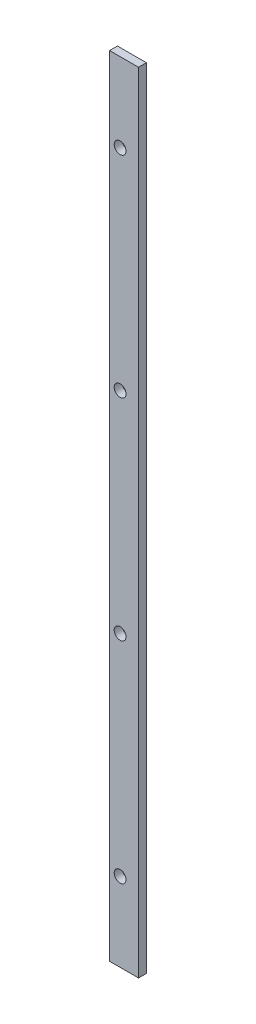
ISO-10303-21;
HEADER;
FILE_DESCRIPTION(('STEP AP214'),'2;1');
FILE_NAME('part.step','',(''),(''),'','','');
FILE_SCHEMA(('AUTOMOTIVE_DESIGN { 1 0 10303 214 1 1 1 1 }'));
ENDSEC;
DATA;
#1=APPLICATION_CONTEXT('core data for automotive mechanical design processes');
#2=APPLICATION_PROTOCOL_DEFINITION('international standard','automotive_design',2000,#1);
#3=PRODUCT_CONTEXT('',#1,'mechanical');
#4=PRODUCT('Part','Part','',(#3));
#5=PRODUCT_RELATED_PRODUCT_CATEGORY('part','',(#4));
#6=PRODUCT_DEFINITION_FORMATION('','',#4);
#7=PRODUCT_DEFINITION_CONTEXT('part definition',#1,'design');
#8=PRODUCT_DEFINITION('design','',#6,#7);
#9=PRODUCT_DEFINITION_SHAPE('','',#8);
#10=(LENGTH_UNIT() NAMED_UNIT(*) SI_UNIT(.MILLI.,.METRE.));
#11=(NAMED_UNIT(*) PLANE_ANGLE_UNIT() SI_UNIT($,.RADIAN.));
#12=(NAMED_UNIT(*) SI_UNIT($,.STERADIAN.) SOLID_ANGLE_UNIT());
#13=UNCERTAINTY_MEASURE_WITH_UNIT(LENGTH_MEASURE(1.E-05),#10,'distance_accuracy_value','');
#14=(GEOMETRIC_REPRESENTATION_CONTEXT(3) GLOBAL_UNCERTAINTY_ASSIGNED_CONTEXT((#13)) GLOBAL_UNIT_ASSIGNED_CONTEXT((#10,
#11,#12)) REPRESENTATION_CONTEXT('',''));
#15=CARTESIAN_POINT('',(0.,0.,0.));
#16=DIRECTION('',(0.,0.,1.));
#17=DIRECTION('',(1.,0.,0.));
#18=AXIS2_PLACEMENT_3D('',#15,#16,#17);
#19=CARTESIAN_POINT('',(0.,0.,3.));
#20=DIRECTION('',(1.,0.,0.));
#21=DIRECTION('',(0.,0.,-1.));
#22=AXIS2_PLACEMENT_3D('',#19,#20,#21);
#23=PLANE('',#22);
#24=DIRECTION('',(0.,-1.,0.));
#25=VECTOR('',#24,1.);
#26=CARTESIAN_POINT('',(0.,0.,0.));
#27=LINE('',#26,#25);
#28=CARTESIAN_POINT('',(0.,300.,0.));
#29=VERTEX_POINT('',#28);
#30=CARTESIAN_POINT('',(0.,0.,0.));
#31=VERTEX_POINT('',#30);
#32=EDGE_CURVE('E118',#29,#31,#27,.T.);
#33=ORIENTED_EDGE('',*,*,#32,.T.);
#34=DIRECTION('',(0.,0.,-1.));
#35=VECTOR('',#34,1.);
#36=CARTESIAN_POINT('',(0.,0.,3.));
#37=LINE('',#36,#35);
#38=CARTESIAN_POINT('',(0.,0.,3.));
#39=VERTEX_POINT('',#38);
#40=EDGE_CURVE('E11',#39,#31,#37,.T.);
#41=ORIENTED_EDGE('',*,*,#40,.F.);
#42=DIRECTION('',(0.,-1.,0.));
#43=VECTOR('',#42,1.);
#44=CARTESIAN_POINT('',(0.,0.,3.));
#45=LINE('',#44,#43);
#46=CARTESIAN_POINT('',(0.,300.,3.));
#47=VERTEX_POINT('',#46);
#48=EDGE_CURVE('E121',#47,#39,#45,.T.);
#49=ORIENTED_EDGE('',*,*,#48,.F.);
#50=DIRECTION('',(0.,0.,-1.));
#51=VECTOR('',#50,1.);
#52=CARTESIAN_POINT('',(0.,300.,3.));
#53=LINE('',#52,#51);
#54=EDGE_CURVE('E41',#47,#29,#53,.T.);
#55=ORIENTED_EDGE('',*,*,#54,.T.);
#56=EDGE_LOOP('',(#33,#41,#49,#55));
#57=FACE_BOUND('',#56,.T.);
#58=ADVANCED_FACE('F33',(#57),#23,.F.);
#59=CARTESIAN_POINT('',(0.,0.,3.));
#60=DIRECTION('',(0.,1.,0.));
#61=DIRECTION('',(0.,0.,1.));
#62=AXIS2_PLACEMENT_3D('',#59,#60,#61);
#63=PLANE('',#62);
#64=DIRECTION('',(1.,0.,0.));
#65=VECTOR('',#64,1.);
#66=CARTESIAN_POINT('',(0.,0.,0.));
#67=LINE('',#66,#65);
#68=CARTESIAN_POINT('',(11.,0.,0.));
#69=VERTEX_POINT('',#68);
#70=EDGE_CURVE('E61',#31,#69,#67,.T.);
#71=ORIENTED_EDGE('',*,*,#70,.T.);
#72=DIRECTION('',(0.,0.,1.));
#73=VECTOR('',#72,1.);
#74=CARTESIAN_POINT('',(11.,0.,0.));
#75=LINE('',#74,#73);
#76=CARTESIAN_POINT('',(11.,0.,3.));
#77=VERTEX_POINT('',#76);
#78=EDGE_CURVE('E89',#69,#77,#75,.T.);
#79=ORIENTED_EDGE('',*,*,#78,.T.);
#80=DIRECTION('',(1.,0.,0.));
#81=VECTOR('',#80,1.);
#82=CARTESIAN_POINT('',(0.,0.,3.));
#83=LINE('',#82,#81);
#84=EDGE_CURVE('E80',#39,#77,#83,.T.);
#85=ORIENTED_EDGE('',*,*,#84,.F.);
#86=ORIENTED_EDGE('',*,*,#40,.T.);
#87=EDGE_LOOP('',(#71,#79,#85,#86));
#88=FACE_BOUND('',#87,.T.);
#89=ADVANCED_FACE('F146',(#88),#63,.F.);
#90=CARTESIAN_POINT('',(0.,300.,3.));
#91=DIRECTION('',(0.,-1.,0.));
#92=DIRECTION('',(0.,0.,-1.));
#93=AXIS2_PLACEMENT_3D('',#90,#91,#92);
#94=PLANE('',#93);
#95=DIRECTION('',(-1.,0.,0.));
#96=VECTOR('',#95,1.);
#97=CARTESIAN_POINT('',(0.,300.,0.));
#98=LINE('',#97,#96);
#99=CARTESIAN_POINT('',(11.,300.,0.));
#100=VERTEX_POINT('',#99);
#101=EDGE_CURVE('E66',#100,#29,#98,.T.);
#102=ORIENTED_EDGE('',*,*,#101,.T.);
#103=ORIENTED_EDGE('',*,*,#54,.F.);
#104=DIRECTION('',(-1.,0.,0.));
#105=VECTOR('',#104,1.);
#106=CARTESIAN_POINT('',(0.,300.,3.));
#107=LINE('',#106,#105);
#108=CARTESIAN_POINT('',(11.,300.,3.));
#109=VERTEX_POINT('',#108);
#110=EDGE_CURVE('E49',#109,#47,#107,.T.);
#111=ORIENTED_EDGE('',*,*,#110,.F.);
#112=DIRECTION('',(0.,0.,1.));
#113=VECTOR('',#112,1.);
#114=CARTESIAN_POINT('',(11.,300.,0.));
#115=LINE('',#114,#113);
#116=EDGE_CURVE('E76',#100,#109,#115,.T.);
#117=ORIENTED_EDGE('',*,*,#116,.F.);
#118=EDGE_LOOP('',(#102,#103,#111,#117));
#119=FACE_BOUND('',#118,.T.);
#120=ADVANCED_FACE('F75',(#119),#94,.F.);
#121=CARTESIAN_POINT('',(0.,0.,3.));
#122=DIRECTION('',(0.,0.,-1.));
#123=DIRECTION('',(-1.,0.,0.));
#124=AXIS2_PLACEMENT_3D('',#121,#122,#123);
#125=PLANE('',#124);
#126=CARTESIAN_POINT('',(4.,30.,3.));
#127=DIRECTION('',(0.,0.,1.));
#128=DIRECTION('',(1.,0.,0.));
#129=AXIS2_PLACEMENT_3D('',#126,#127,#128);
#130=CIRCLE('',#129,2.25);
#131=CARTESIAN_POINT('',(6.25,30.,3.));
#132=VERTEX_POINT('',#131);
#133=EDGE_CURVE('E101',#132,#132,#130,.T.);
#134=ORIENTED_EDGE('',*,*,#133,.F.);
#135=EDGE_LOOP('',(#134));
#136=FACE_BOUND('',#135,.T.);
#137=CARTESIAN_POINT('',(4.,270.,3.));
#138=DIRECTION('',(0.,0.,1.));
#139=DIRECTION('',(-1.,0.,0.));
#140=AXIS2_PLACEMENT_3D('',#137,#138,#139);
#141=CIRCLE('',#140,2.25);
#142=CARTESIAN_POINT('',(1.75,270.,3.));
#143=VERTEX_POINT('',#142);
#144=EDGE_CURVE('E107',#143,#143,#141,.T.);
#145=ORIENTED_EDGE('',*,*,#144,.F.);
#146=EDGE_LOOP('',(#145));
#147=FACE_BOUND('',#146,.T.);
#148=CARTESIAN_POINT('',(4.,190.,3.));
#149=DIRECTION('',(0.,0.,1.));
#150=DIRECTION('',(-1.,0.,0.));
#151=AXIS2_PLACEMENT_3D('',#148,#149,#150);
#152=CIRCLE('',#151,2.25);
#153=CARTESIAN_POINT('',(1.75,190.,3.));
#154=VERTEX_POINT('',#153);
#155=EDGE_CURVE('E88',#154,#154,#152,.T.);
#156=ORIENTED_EDGE('',*,*,#155,.F.);
#157=EDGE_LOOP('',(#156));
#158=FACE_BOUND('',#157,.T.);
#159=CARTESIAN_POINT('',(4.,110.,3.));
#160=DIRECTION('',(0.,0.,1.));
#161=DIRECTION('',(1.,0.,0.));
#162=AXIS2_PLACEMENT_3D('',#159,#160,#161);
#163=CIRCLE('',#162,2.25);
#164=CARTESIAN_POINT('',(6.25,110.,3.));
#165=VERTEX_POINT('',#164);
#166=EDGE_CURVE('E100',#165,#165,#163,.T.);
#167=ORIENTED_EDGE('',*,*,#166,.F.);
#168=EDGE_LOOP('',(#167));
#169=FACE_BOUND('',#168,.T.);
#170=ORIENTED_EDGE('',*,*,#48,.T.);
#171=ORIENTED_EDGE('',*,*,#84,.T.);
#172=DIRECTION('',(0.,1.,0.));
#173=VECTOR('',#172,1.);
#174=CARTESIAN_POINT('',(11.,0.,3.));
#175=LINE('',#174,#173);
#176=EDGE_CURVE('E86',#77,#109,#175,.T.);
#177=ORIENTED_EDGE('',*,*,#176,.T.);
#178=ORIENTED_EDGE('',*,*,#110,.T.);
#179=EDGE_LOOP('',(#170,#171,#177,#178));
#180=FACE_BOUND('',#179,.T.);
#181=ADVANCED_FACE('F91',(#136,#147,#158,#169,#180),#125,.F.);
#182=CARTESIAN_POINT('',(0.,0.,0.));
#183=DIRECTION('',(0.,0.,-1.));
#184=DIRECTION('',(-1.,0.,0.));
#185=AXIS2_PLACEMENT_3D('',#182,#183,#184);
#186=PLANE('',#185);
#187=CARTESIAN_POINT('',(4.,30.,0.));
#188=DIRECTION('',(0.,0.,1.));
#189=DIRECTION('',(1.,0.,0.));
#190=AXIS2_PLACEMENT_3D('',#187,#188,#189);
#191=CIRCLE('',#190,2.25);
#192=CARTESIAN_POINT('',(6.25,30.,0.));
#193=VERTEX_POINT('',#192);
#194=EDGE_CURVE('E97',#193,#193,#191,.T.);
#195=ORIENTED_EDGE('',*,*,#194,.T.);
#196=EDGE_LOOP('',(#195));
#197=FACE_BOUND('',#196,.T.);
#198=CARTESIAN_POINT('',(4.,270.,0.));
#199=DIRECTION('',(0.,0.,1.));
#200=DIRECTION('',(-1.,0.,0.));
#201=AXIS2_PLACEMENT_3D('',#198,#199,#200);
#202=CIRCLE('',#201,2.25);
#203=CARTESIAN_POINT('',(1.75,270.,0.));
#204=VERTEX_POINT('',#203);
#205=EDGE_CURVE('E104',#204,#204,#202,.T.);
#206=ORIENTED_EDGE('',*,*,#205,.T.);
#207=EDGE_LOOP('',(#206));
#208=FACE_BOUND('',#207,.T.);
#209=CARTESIAN_POINT('',(4.,190.,0.));
#210=DIRECTION('',(0.,0.,1.));
#211=DIRECTION('',(-1.,0.,0.));
#212=AXIS2_PLACEMENT_3D('',#209,#210,#211);
#213=CIRCLE('',#212,2.25);
#214=CARTESIAN_POINT('',(1.75,190.,0.));
#215=VERTEX_POINT('',#214);
#216=EDGE_CURVE('E110',#215,#215,#213,.T.);
#217=ORIENTED_EDGE('',*,*,#216,.T.);
#218=EDGE_LOOP('',(#217));
#219=FACE_BOUND('',#218,.T.);
#220=CARTESIAN_POINT('',(4.,110.,0.));
#221=DIRECTION('',(0.,0.,1.));
#222=DIRECTION('',(1.,0.,0.));
#223=AXIS2_PLACEMENT_3D('',#220,#221,#222);
#224=CIRCLE('',#223,2.25);
#225=CARTESIAN_POINT('',(6.25,110.,0.));
#226=VERTEX_POINT('',#225);
#227=EDGE_CURVE('E115',#226,#226,#224,.T.);
#228=ORIENTED_EDGE('',*,*,#227,.T.);
#229=EDGE_LOOP('',(#228));
#230=FACE_BOUND('',#229,.T.);
#231=ORIENTED_EDGE('',*,*,#32,.F.);
#232=ORIENTED_EDGE('',*,*,#101,.F.);
#233=DIRECTION('',(0.,1.,0.));
#234=VECTOR('',#233,1.);
#235=CARTESIAN_POINT('',(11.,0.,0.));
#236=LINE('',#235,#234);
#237=EDGE_CURVE('E87',#69,#100,#236,.T.);
#238=ORIENTED_EDGE('',*,*,#237,.F.);
#239=ORIENTED_EDGE('',*,*,#70,.F.);
#240=EDGE_LOOP('',(#231,#232,#238,#239));
#241=FACE_BOUND('',#240,.T.);
#242=ADVANCED_FACE('F129',(#197,#208,#219,#230,#241),#186,.T.);
#243=CARTESIAN_POINT('',(4.,110.,0.));
#244=DIRECTION('',(0.,0.,1.));
#245=DIRECTION('',(1.,0.,0.));
#246=AXIS2_PLACEMENT_3D('',#243,#244,#245);
#247=CYLINDRICAL_SURFACE('',#246,2.25);
#248=ORIENTED_EDGE('',*,*,#227,.F.);
#249=EDGE_LOOP('',(#248));
#250=FACE_BOUND('',#249,.T.);
#251=ORIENTED_EDGE('',*,*,#166,.T.);
#252=EDGE_LOOP('',(#251));
#253=FACE_BOUND('',#252,.T.);
#254=ADVANCED_FACE('F131',(#250,#253),#247,.F.);
#255=CARTESIAN_POINT('',(4.,190.,0.));
#256=DIRECTION('',(0.,0.,1.));
#257=DIRECTION('',(1.,0.,0.));
#258=AXIS2_PLACEMENT_3D('',#255,#256,#257);
#259=CYLINDRICAL_SURFACE('',#258,2.25);
#260=ORIENTED_EDGE('',*,*,#216,.F.);
#261=EDGE_LOOP('',(#260));
#262=FACE_BOUND('',#261,.T.);
#263=ORIENTED_EDGE('',*,*,#155,.T.);
#264=EDGE_LOOP('',(#263));
#265=FACE_BOUND('',#264,.T.);
#266=ADVANCED_FACE('F138',(#262,#265),#259,.F.);
#267=CARTESIAN_POINT('',(4.,270.,0.));
#268=DIRECTION('',(0.,0.,1.));
#269=DIRECTION('',(1.,0.,0.));
#270=AXIS2_PLACEMENT_3D('',#267,#268,#269);
#271=CYLINDRICAL_SURFACE('',#270,2.25);
#272=ORIENTED_EDGE('',*,*,#205,.F.);
#273=EDGE_LOOP('',(#272));
#274=FACE_BOUND('',#273,.T.);
#275=ORIENTED_EDGE('',*,*,#144,.T.);
#276=EDGE_LOOP('',(#275));
#277=FACE_BOUND('',#276,.T.);
#278=ADVANCED_FACE('F183',(#274,#277),#271,.F.);
#279=CARTESIAN_POINT('',(4.,30.,0.));
#280=DIRECTION('',(0.,0.,1.));
#281=DIRECTION('',(1.,0.,0.));
#282=AXIS2_PLACEMENT_3D('',#279,#280,#281);
#283=CYLINDRICAL_SURFACE('',#282,2.25);
#284=ORIENTED_EDGE('',*,*,#194,.F.);
#285=EDGE_LOOP('',(#284));
#286=FACE_BOUND('',#285,.T.);
#287=ORIENTED_EDGE('',*,*,#133,.T.);
#288=EDGE_LOOP('',(#287));
#289=FACE_BOUND('',#288,.T.);
#290=ADVANCED_FACE('F174',(#286,#289),#283,.F.);
#291=CARTESIAN_POINT('',(11.,0.,0.));
#292=DIRECTION('',(1.,0.,0.));
#293=DIRECTION('',(0.,0.,-1.));
#294=AXIS2_PLACEMENT_3D('',#291,#292,#293);
#295=PLANE('',#294);
#296=ORIENTED_EDGE('',*,*,#176,.F.);
#297=ORIENTED_EDGE('',*,*,#78,.F.);
#298=ORIENTED_EDGE('',*,*,#237,.T.);
#299=ORIENTED_EDGE('',*,*,#116,.T.);
#300=EDGE_LOOP('',(#296,#297,#298,#299));
#301=FACE_BOUND('',#300,.T.);
#302=ADVANCED_FACE('F84',(#301),#295,.T.);
#303=CLOSED_SHELL('',(#58,#89,#120,#181,#242,#254,#266,#278,#290,#302));
#304=MANIFOLD_SOLID_BREP('B2',#303);
#305=ADVANCED_BREP_SHAPE_REPRESENTATION('',(#18,#304),#14);
#306=SHAPE_DEFINITION_REPRESENTATION(#9,#305);
ENDSEC;
END-ISO-10303-21;
